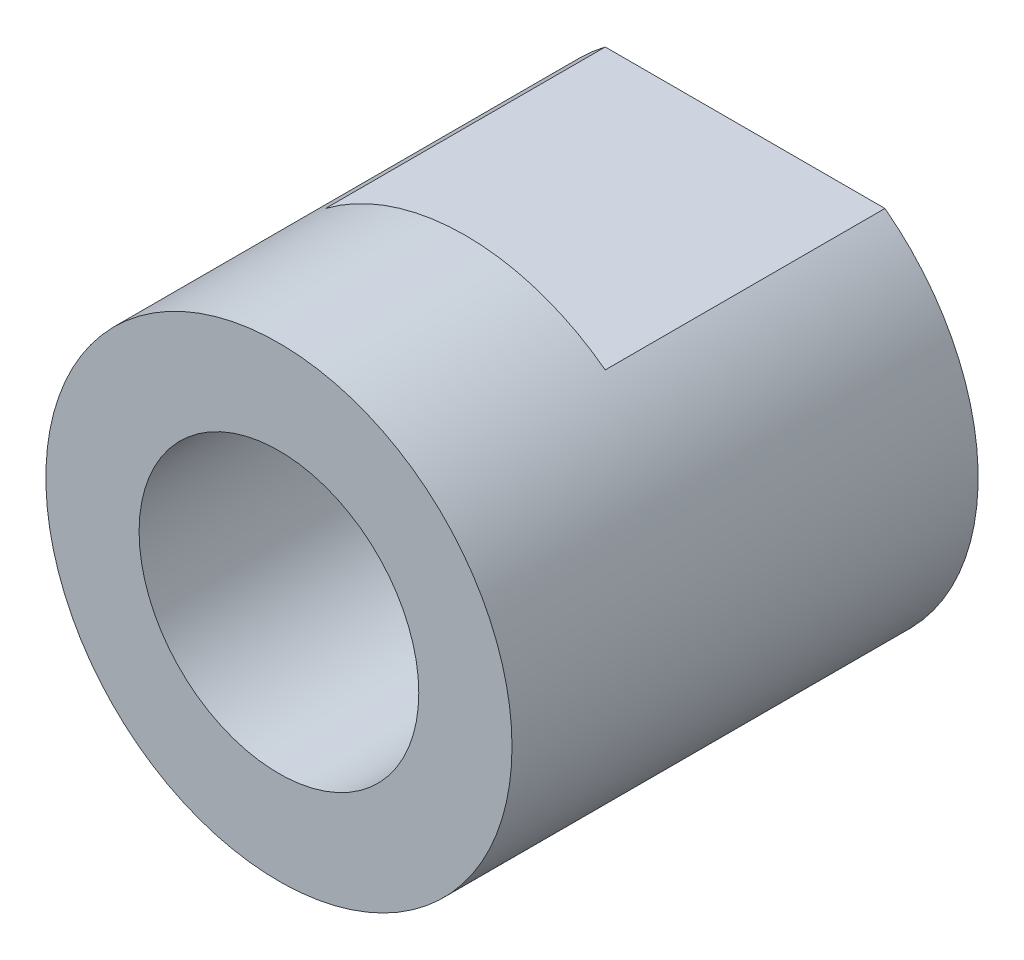
ISO-10303-21;
HEADER;
FILE_DESCRIPTION(('STEP AP214'),'2;1');
FILE_NAME('part.step','',(''),(''),'','','');
FILE_SCHEMA(('AUTOMOTIVE_DESIGN { 1 0 10303 214 1 1 1 1 }'));
ENDSEC;
DATA;
#1=APPLICATION_CONTEXT('core data for automotive mechanical design processes');
#2=APPLICATION_PROTOCOL_DEFINITION('international standard','automotive_design',2000,#1);
#3=PRODUCT_CONTEXT('',#1,'mechanical');
#4=PRODUCT('Part','Part','',(#3));
#5=PRODUCT_RELATED_PRODUCT_CATEGORY('part','',(#4));
#6=PRODUCT_DEFINITION_FORMATION('','',#4);
#7=PRODUCT_DEFINITION_CONTEXT('part definition',#1,'design');
#8=PRODUCT_DEFINITION('design','',#6,#7);
#9=PRODUCT_DEFINITION_SHAPE('','',#8);
#10=(LENGTH_UNIT() NAMED_UNIT(*) SI_UNIT(.MILLI.,.METRE.));
#11=(NAMED_UNIT(*) PLANE_ANGLE_UNIT() SI_UNIT($,.RADIAN.));
#12=(NAMED_UNIT(*) SI_UNIT($,.STERADIAN.) SOLID_ANGLE_UNIT());
#13=UNCERTAINTY_MEASURE_WITH_UNIT(LENGTH_MEASURE(1.E-05),#10,'distance_accuracy_value','');
#14=(GEOMETRIC_REPRESENTATION_CONTEXT(3) GLOBAL_UNCERTAINTY_ASSIGNED_CONTEXT((#13)) GLOBAL_UNIT_ASSIGNED_CONTEXT((#10,
#11,#12)) REPRESENTATION_CONTEXT('',''));
#15=CARTESIAN_POINT('',(0.,0.,0.));
#16=DIRECTION('',(0.,0.,1.));
#17=DIRECTION('',(1.,0.,0.));
#18=AXIS2_PLACEMENT_3D('',#15,#16,#17);
#19=CARTESIAN_POINT('',(0.,0.,10.));
#20=DIRECTION('',(0.,0.,-1.));
#21=DIRECTION('',(-1.,0.,0.));
#22=AXIS2_PLACEMENT_3D('',#19,#20,#21);
#23=CYLINDRICAL_SURFACE('',#22,5.);
#24=CARTESIAN_POINT('',(0.,0.,10.));
#25=DIRECTION('',(0.,0.,1.));
#26=DIRECTION('',(1.,0.,0.));
#27=AXIS2_PLACEMENT_3D('',#24,#25,#26);
#28=CIRCLE('',#27,5.);
#29=CARTESIAN_POINT('',(5.,0.,10.));
#30=VERTEX_POINT('',#29);
#31=EDGE_CURVE('E82',#30,#30,#28,.T.);
#32=ORIENTED_EDGE('',*,*,#31,.F.);
#33=EDGE_LOOP('',(#32));
#34=FACE_BOUND('',#33,.T.);
#35=DIRECTION('',(0.,0.,-1.));
#36=VECTOR('',#35,1.);
#37=CARTESIAN_POINT('',(3.,4.,10.));
#38=LINE('',#37,#36);
#39=CARTESIAN_POINT('',(3.,4.,6.));
#40=VERTEX_POINT('',#39);
#41=CARTESIAN_POINT('',(3.,4.,0.));
#42=VERTEX_POINT('',#41);
#43=EDGE_CURVE('E55',#40,#42,#38,.T.);
#44=ORIENTED_EDGE('',*,*,#43,.F.);
#45=CARTESIAN_POINT('',(0.,0.,6.));
#46=DIRECTION('',(0.,0.,-1.));
#47=DIRECTION('',(-1.,0.,0.));
#48=AXIS2_PLACEMENT_3D('',#45,#46,#47);
#49=CIRCLE('',#48,5.);
#50=CARTESIAN_POINT('',(-3.,4.,6.));
#51=VERTEX_POINT('',#50);
#52=EDGE_CURVE('E11',#51,#40,#49,.T.);
#53=ORIENTED_EDGE('',*,*,#52,.F.);
#54=DIRECTION('',(0.,0.,-1.));
#55=VECTOR('',#54,1.);
#56=CARTESIAN_POINT('',(-3.,4.,10.));
#57=LINE('',#56,#55);
#58=CARTESIAN_POINT('',(-3.,4.,0.));
#59=VERTEX_POINT('',#58);
#60=EDGE_CURVE('E104',#59,#51,#57,.F.);
#61=ORIENTED_EDGE('',*,*,#60,.F.);
#62=CARTESIAN_POINT('',(0.,0.,0.));
#63=DIRECTION('',(0.,0.,1.));
#64=DIRECTION('',(1.,0.,0.));
#65=AXIS2_PLACEMENT_3D('',#62,#63,#64);
#66=CIRCLE('',#65,5.);
#67=CARTESIAN_POINT('',(-3.,-4.,0.));
#68=VERTEX_POINT('',#67);
#69=EDGE_CURVE('E90',#59,#68,#66,.T.);
#70=ORIENTED_EDGE('',*,*,#69,.T.);
#71=DIRECTION('',(0.,0.,-1.));
#72=VECTOR('',#71,1.);
#73=CARTESIAN_POINT('',(-3.,-4.,10.));
#74=LINE('',#73,#72);
#75=CARTESIAN_POINT('',(-3.,-4.,6.));
#76=VERTEX_POINT('',#75);
#77=EDGE_CURVE('E47',#76,#68,#74,.T.);
#78=ORIENTED_EDGE('',*,*,#77,.F.);
#79=CARTESIAN_POINT('',(0.,0.,6.));
#80=DIRECTION('',(0.,0.,-1.));
#81=DIRECTION('',(-1.,0.,0.));
#82=AXIS2_PLACEMENT_3D('',#79,#80,#81);
#83=CIRCLE('',#82,5.);
#84=CARTESIAN_POINT('',(3.,-4.,6.));
#85=VERTEX_POINT('',#84);
#86=EDGE_CURVE('E40',#85,#76,#83,.T.);
#87=ORIENTED_EDGE('',*,*,#86,.F.);
#88=DIRECTION('',(0.,0.,-1.));
#89=VECTOR('',#88,1.);
#90=CARTESIAN_POINT('',(3.,-4.,10.));
#91=LINE('',#90,#89);
#92=CARTESIAN_POINT('',(3.,-4.,0.));
#93=VERTEX_POINT('',#92);
#94=EDGE_CURVE('E75',#93,#85,#91,.F.);
#95=ORIENTED_EDGE('',*,*,#94,.F.);
#96=EDGE_CURVE('E86',#93,#42,#66,.T.);
#97=ORIENTED_EDGE('',*,*,#96,.T.);
#98=EDGE_LOOP('',(#44,#53,#61,#70,#78,#87,#95,#97));
#99=FACE_BOUND('',#98,.T.);
#100=ADVANCED_FACE('F33',(#34,#99),#23,.T.);
#101=CARTESIAN_POINT('',(0.,0.,0.));
#102=DIRECTION('',(0.,0.,1.));
#103=DIRECTION('',(1.,0.,0.));
#104=AXIS2_PLACEMENT_3D('',#101,#102,#103);
#105=PLANE('',#104);
#106=CARTESIAN_POINT('',(0.,0.,0.));
#107=DIRECTION('',(0.,0.,1.));
#108=DIRECTION('',(1.,0.,0.));
#109=AXIS2_PLACEMENT_3D('',#106,#107,#108);
#110=CIRCLE('',#109,3.);
#111=CARTESIAN_POINT('',(3.,0.,0.));
#112=VERTEX_POINT('',#111);
#113=EDGE_CURVE('E91',#112,#112,#110,.T.);
#114=ORIENTED_EDGE('',*,*,#113,.T.);
#115=EDGE_LOOP('',(#114));
#116=FACE_BOUND('',#115,.T.);
#117=DIRECTION('',(-1.,0.,0.));
#118=VECTOR('',#117,1.);
#119=CARTESIAN_POINT('',(0.,4.,0.));
#120=LINE('',#119,#118);
#121=EDGE_CURVE('E81',#42,#59,#120,.T.);
#122=ORIENTED_EDGE('',*,*,#121,.F.);
#123=ORIENTED_EDGE('',*,*,#96,.F.);
#124=DIRECTION('',(1.,0.,0.));
#125=VECTOR('',#124,1.);
#126=CARTESIAN_POINT('',(0.,-4.,0.));
#127=LINE('',#126,#125);
#128=EDGE_CURVE('E72',#68,#93,#127,.T.);
#129=ORIENTED_EDGE('',*,*,#128,.F.);
#130=ORIENTED_EDGE('',*,*,#69,.F.);
#131=EDGE_LOOP('',(#122,#123,#129,#130));
#132=FACE_BOUND('',#131,.T.);
#133=ADVANCED_FACE('F89',(#116,#132),#105,.F.);
#134=CARTESIAN_POINT('',(0.,0.,10.));
#135=DIRECTION('',(0.,0.,1.));
#136=DIRECTION('',(1.,0.,0.));
#137=AXIS2_PLACEMENT_3D('',#134,#135,#136);
#138=PLANE('',#137);
#139=CARTESIAN_POINT('',(0.,0.,10.));
#140=DIRECTION('',(0.,0.,1.));
#141=DIRECTION('',(1.,0.,0.));
#142=AXIS2_PLACEMENT_3D('',#139,#140,#141);
#143=CIRCLE('',#142,3.);
#144=CARTESIAN_POINT('',(3.,0.,10.));
#145=VERTEX_POINT('',#144);
#146=EDGE_CURVE('E94',#145,#145,#143,.T.);
#147=ORIENTED_EDGE('',*,*,#146,.F.);
#148=EDGE_LOOP('',(#147));
#149=FACE_BOUND('',#148,.T.);
#150=ORIENTED_EDGE('',*,*,#31,.T.);
#151=EDGE_LOOP('',(#150));
#152=FACE_BOUND('',#151,.T.);
#153=ADVANCED_FACE('F113',(#149,#152),#138,.T.);
#154=CARTESIAN_POINT('',(0.,0.,0.));
#155=DIRECTION('',(0.,0.,1.));
#156=DIRECTION('',(1.,0.,0.));
#157=AXIS2_PLACEMENT_3D('',#154,#155,#156);
#158=CYLINDRICAL_SURFACE('',#157,3.);
#159=ORIENTED_EDGE('',*,*,#113,.F.);
#160=EDGE_LOOP('',(#159));
#161=FACE_BOUND('',#160,.T.);
#162=ORIENTED_EDGE('',*,*,#146,.T.);
#163=EDGE_LOOP('',(#162));
#164=FACE_BOUND('',#163,.T.);
#165=ADVANCED_FACE('F111',(#161,#164),#158,.F.);
#166=CARTESIAN_POINT('',(10.,-5.,6.));
#167=DIRECTION('',(0.,0.,-1.));
#168=DIRECTION('',(-1.,0.,0.));
#169=AXIS2_PLACEMENT_3D('',#166,#167,#168);
#170=PLANE('',#169);
#171=DIRECTION('',(-1.,0.,0.));
#172=VECTOR('',#171,1.);
#173=CARTESIAN_POINT('',(10.,-4.,6.));
#174=LINE('',#173,#172);
#175=EDGE_CURVE('E101',#85,#76,#174,.T.);
#176=ORIENTED_EDGE('',*,*,#175,.F.);
#177=ORIENTED_EDGE('',*,*,#86,.T.);
#178=EDGE_LOOP('',(#176,#177));
#179=FACE_BOUND('',#178,.T.);
#180=ADVANCED_FACE('F100',(#179),#170,.T.);
#181=CARTESIAN_POINT('',(10.,-4.,0.));
#182=DIRECTION('',(0.,-1.,0.));
#183=DIRECTION('',(0.,0.,-1.));
#184=AXIS2_PLACEMENT_3D('',#181,#182,#183);
#185=PLANE('',#184);
#186=ORIENTED_EDGE('',*,*,#77,.T.);
#187=ORIENTED_EDGE('',*,*,#128,.T.);
#188=ORIENTED_EDGE('',*,*,#94,.T.);
#189=ORIENTED_EDGE('',*,*,#175,.T.);
#190=EDGE_LOOP('',(#186,#187,#188,#189));
#191=FACE_BOUND('',#190,.T.);
#192=ADVANCED_FACE('F74',(#191),#185,.T.);
#193=CARTESIAN_POINT('',(10.,5.,6.));
#194=DIRECTION('',(0.,0.,-1.));
#195=DIRECTION('',(-1.,0.,0.));
#196=AXIS2_PLACEMENT_3D('',#193,#194,#195);
#197=PLANE('',#196);
#198=ORIENTED_EDGE('',*,*,#52,.T.);
#199=DIRECTION('',(-1.,0.,0.));
#200=VECTOR('',#199,1.);
#201=CARTESIAN_POINT('',(10.,4.,6.));
#202=LINE('',#201,#200);
#203=EDGE_CURVE('E87',#40,#51,#202,.T.);
#204=ORIENTED_EDGE('',*,*,#203,.T.);
#205=EDGE_LOOP('',(#198,#204));
#206=FACE_BOUND('',#205,.T.);
#207=ADVANCED_FACE('F133',(#206),#197,.T.);
#208=CARTESIAN_POINT('',(10.,4.,0.));
#209=DIRECTION('',(0.,1.,0.));
#210=DIRECTION('',(0.,0.,1.));
#211=AXIS2_PLACEMENT_3D('',#208,#209,#210);
#212=PLANE('',#211);
#213=ORIENTED_EDGE('',*,*,#43,.T.);
#214=ORIENTED_EDGE('',*,*,#121,.T.);
#215=ORIENTED_EDGE('',*,*,#60,.T.);
#216=ORIENTED_EDGE('',*,*,#203,.F.);
#217=EDGE_LOOP('',(#213,#214,#215,#216));
#218=FACE_BOUND('',#217,.T.);
#219=ADVANCED_FACE('F138',(#218),#212,.T.);
#220=CLOSED_SHELL('',(#100,#133,#153,#165,#180,#192,#207,#219));
#221=MANIFOLD_SOLID_BREP('B2',#220);
#222=ADVANCED_BREP_SHAPE_REPRESENTATION('',(#18,#221),#14);
#223=SHAPE_DEFINITION_REPRESENTATION(#9,#222);
ENDSEC;
END-ISO-10303-21;
